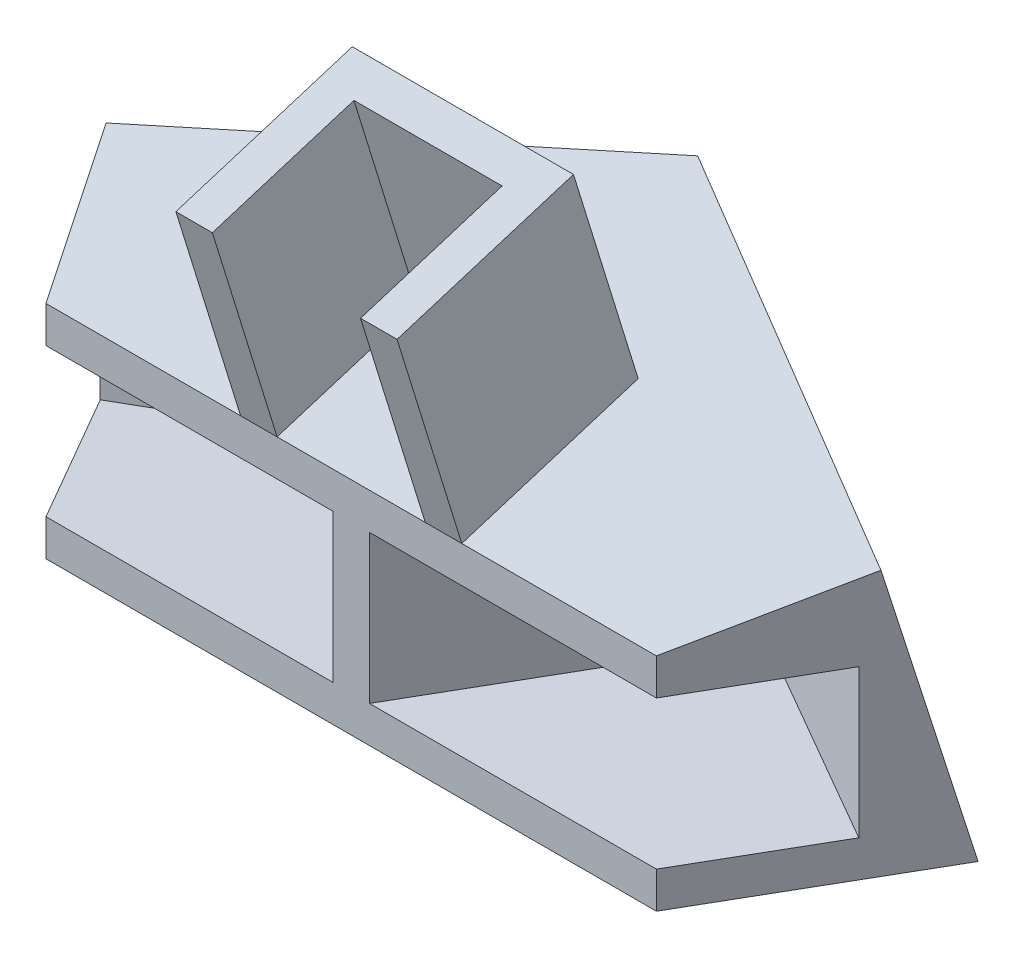
ISO-10303-21;
HEADER;
FILE_DESCRIPTION(('STEP AP214'),'2;1');
FILE_NAME('part.step','',(''),(''),'','','');
FILE_SCHEMA(('AUTOMOTIVE_DESIGN { 1 0 10303 214 1 1 1 1 }'));
ENDSEC;
DATA;
#1=APPLICATION_CONTEXT('core data for automotive mechanical design processes');
#2=APPLICATION_PROTOCOL_DEFINITION('international standard','automotive_design',2000,#1);
#3=PRODUCT_CONTEXT('',#1,'mechanical');
#4=PRODUCT('Part','Part','',(#3));
#5=PRODUCT_RELATED_PRODUCT_CATEGORY('part','',(#4));
#6=PRODUCT_DEFINITION_FORMATION('','',#4);
#7=PRODUCT_DEFINITION_CONTEXT('part definition',#1,'design');
#8=PRODUCT_DEFINITION('design','',#6,#7);
#9=PRODUCT_DEFINITION_SHAPE('','',#8);
#10=(LENGTH_UNIT() NAMED_UNIT(*) SI_UNIT(.MILLI.,.METRE.));
#11=(NAMED_UNIT(*) PLANE_ANGLE_UNIT() SI_UNIT($,.RADIAN.));
#12=(NAMED_UNIT(*) SI_UNIT($,.STERADIAN.) SOLID_ANGLE_UNIT());
#13=UNCERTAINTY_MEASURE_WITH_UNIT(LENGTH_MEASURE(1.E-05),#10,'distance_accuracy_value','');
#14=(GEOMETRIC_REPRESENTATION_CONTEXT(3) GLOBAL_UNCERTAINTY_ASSIGNED_CONTEXT((#13)) GLOBAL_UNIT_ASSIGNED_CONTEXT((#10,
#11,#12)) REPRESENTATION_CONTEXT('',''));
#15=CARTESIAN_POINT('',(0.,0.,0.));
#16=DIRECTION('',(0.,0.,1.));
#17=DIRECTION('',(1.,0.,0.));
#18=AXIS2_PLACEMENT_3D('',#15,#16,#17);
#19=CARTESIAN_POINT('',(-57.939271962345,30.3,24.1398947677254));
#20=DIRECTION('',(0.,-0.955319003127933,-0.295576728215624));
#21=DIRECTION('',(0.,0.295576728215624,-0.955319003127933));
#22=AXIS2_PLACEMENT_3D('',#19,#20,#21);
#23=PLANE('',#22);
#24=DIRECTION('',(-1.,0.,0.));
#25=VECTOR('',#24,1.);
#26=CARTESIAN_POINT('',(0.,37.7780912238553,-0.0296760114113));
#27=LINE('',#26,#25);
#28=CARTESIAN_POINT('',(15.1499999999999,37.7780912238553,-0.0296760114113717));
#29=VERTEX_POINT('',#28);
#30=CARTESIAN_POINT('',(-15.1499999999999,37.7780912238553,-0.0296760114112948));
#31=VERTEX_POINT('',#30);
#32=EDGE_CURVE('E238',#29,#31,#27,.T.);
#33=ORIENTED_EDGE('',*,*,#32,.F.);
#34=DIRECTION('',(0.,-0.295576728215624,0.955319003127932));
#35=VECTOR('',#34,1.);
#36=CARTESIAN_POINT('',(15.1499999999999,37.7780912238553,-0.0296760114113717));
#37=LINE('',#36,#35);
#38=CARTESIAN_POINT('',(15.1500000000001,30.3,24.1398947677253));
#39=VERTEX_POINT('',#38);
#40=EDGE_CURVE('E335',#29,#39,#37,.T.);
#41=ORIENTED_EDGE('',*,*,#40,.T.);
#42=DIRECTION('',(1.,0.,0.));
#43=VECTOR('',#42,1.);
#44=CARTESIAN_POINT('',(-57.939271962345,30.3,24.1398947677254));
#45=LINE('',#44,#43);
#46=CARTESIAN_POINT('',(41.8115242270664,30.3,24.1398947677252));
#47=VERTEX_POINT('',#46);
#48=EDGE_CURVE('E254',#39,#47,#45,.T.);
#49=ORIENTED_EDGE('',*,*,#48,.T.);
#50=DIRECTION('',(-0.482962913144532,-0.258819045102506,0.836516303737813));
#51=VECTOR('',#50,1.);
#52=CARTESIAN_POINT('',(50.4516349060031,34.930221357873,9.17478408878811));
#53=LINE('',#52,#51);
#54=CARTESIAN_POINT('',(53.0714177169951,36.3341587349734,4.6371871553544));
#55=VERTEX_POINT('',#54);
#56=EDGE_CURVE('E55',#55,#47,#53,.T.);
#57=ORIENTED_EDGE('',*,*,#56,.F.);
#58=DIRECTION('',(0.875640807938362,-0.142752597716748,0.461383648732997));
#59=VECTOR('',#58,1.);
#60=CARTESIAN_POINT('',(-50.6819620165036,53.2487021694221,-50.0314766116174));
#61=LINE('',#60,#59);
#62=CARTESIAN_POINT('',(0.,44.9862026723147,-23.3266584394525));
#63=VERTEX_POINT('',#62);
#64=EDGE_CURVE('E11',#63,#55,#61,.T.);
#65=ORIENTED_EDGE('',*,*,#64,.F.);
#66=DIRECTION('',(0.875640807938359,0.142752597716748,-0.461383648733001));
#67=VECTOR('',#66,1.);
#68=CARTESIAN_POINT('',(7.22750804474477,46.164477530056,-27.1349026449534));
#69=LINE('',#68,#67);
#70=CARTESIAN_POINT('',(-53.0714177169951,36.3341587349734,4.63718715535465));
#71=VERTEX_POINT('',#70);
#72=EDGE_CURVE('E40',#71,#63,#69,.T.);
#73=ORIENTED_EDGE('',*,*,#72,.F.);
#74=DIRECTION('',(-0.482962913144536,0.258819045102507,-0.836516303737811));
#75=VECTOR('',#74,1.);
#76=CARTESIAN_POINT('',(-50.4516349060031,34.930221357873,9.17478408878837));
#77=LINE('',#76,#75);
#78=CARTESIAN_POINT('',(-41.8115242270663,30.3,24.1398947677254));
#79=VERTEX_POINT('',#78);
#80=EDGE_CURVE('E258',#79,#71,#77,.T.);
#81=ORIENTED_EDGE('',*,*,#80,.F.);
#82=CARTESIAN_POINT('',(-15.15,30.3,24.1398947677253));
#83=VERTEX_POINT('',#82);
#84=EDGE_CURVE('E255',#79,#83,#45,.T.);
#85=ORIENTED_EDGE('',*,*,#84,.T.);
#86=DIRECTION('',(0.,-0.295576728215624,0.955319003127932));
#87=VECTOR('',#86,1.);
#88=CARTESIAN_POINT('',(-15.1499999999999,37.7780912238553,-0.0296760114112948));
#89=LINE('',#88,#87);
#90=EDGE_CURVE('E222',#31,#83,#89,.T.);
#91=ORIENTED_EDGE('',*,*,#90,.F.);
#92=EDGE_LOOP('',(#33,#41,#49,#57,#65,#73,#81,#85,#91));
#93=FACE_BOUND('',#92,.T.);
#94=ADVANCED_FACE('F32',(#93),#23,.F.);
#95=CARTESIAN_POINT('',(54.4615242270663,5.,2.22945205197881));
#96=DIRECTION('',(0.866025403784441,0.,0.499999999999996));
#97=DIRECTION('',(0.499999999999996,0.,-0.866025403784441));
#98=AXIS2_PLACEMENT_3D('',#95,#96,#97);
#99=PLANE('',#98);
#100=DIRECTION('',(-0.129409522551252,0.965925826289072,0.224143868042001));
#101=VECTOR('',#100,1.);
#102=CARTESIAN_POINT('',(57.9392719623449,0.,-3.79418372143149));
#103=LINE('',#102,#101);
#104=CARTESIAN_POINT('',(57.9392719623449,0.,-3.79418372143149));
#105=VERTEX_POINT('',#104);
#106=EDGE_CURVE('E375',#105,#55,#103,.T.);
#107=ORIENTED_EDGE('',*,*,#106,.T.);
#108=ORIENTED_EDGE('',*,*,#56,.T.);
#109=DIRECTION('',(0.,-1.,0.));
#110=VECTOR('',#109,1.);
#111=CARTESIAN_POINT('',(41.8115242270664,30.3,24.1398947677251));
#112=LINE('',#111,#110);
#113=CARTESIAN_POINT('',(41.8115242270664,25.3,24.1398947677251));
#114=VERTEX_POINT('',#113);
#115=EDGE_CURVE('E343',#47,#114,#112,.T.);
#116=ORIENTED_EDGE('',*,*,#115,.T.);
#117=DIRECTION('',(-0.499999999999997,0.,0.86602540378444));
#118=VECTOR('',#117,1.);
#119=CARTESIAN_POINT('',(65.1667800070895,25.3,-16.3125948670419));
#120=LINE('',#119,#118);
#121=CARTESIAN_POINT('',(51.9615242270663,25.3,6.55957907090102));
#122=VERTEX_POINT('',#121);
#123=EDGE_CURVE('E383',#122,#114,#120,.T.);
#124=ORIENTED_EDGE('',*,*,#123,.F.);
#125=DIRECTION('',(0.,-1.,0.));
#126=VECTOR('',#125,1.);
#127=CARTESIAN_POINT('',(51.9615242270663,25.3,6.55957907090102));
#128=LINE('',#127,#126);
#129=CARTESIAN_POINT('',(51.9615242270663,5.,6.55957907090102));
#130=VERTEX_POINT('',#129);
#131=EDGE_CURVE('E206',#122,#130,#128,.T.);
#132=ORIENTED_EDGE('',*,*,#131,.T.);
#133=DIRECTION('',(-0.499999999999999,0.,0.866025403784439));
#134=VECTOR('',#133,1.);
#135=CARTESIAN_POINT('',(54.4615242270663,5.,2.22945205197881));
#136=LINE('',#135,#134);
#137=CARTESIAN_POINT('',(41.8115242270664,5.,24.1398947677251));
#138=VERTEX_POINT('',#137);
#139=EDGE_CURVE('E198',#130,#138,#136,.T.);
#140=ORIENTED_EDGE('',*,*,#139,.T.);
#141=DIRECTION('',(0.,-1.,0.));
#142=VECTOR('',#141,1.);
#143=CARTESIAN_POINT('',(41.8115242270664,5.,24.1398947677251));
#144=LINE('',#143,#142);
#145=CARTESIAN_POINT('',(41.8115242270664,0.,24.1398947677251));
#146=VERTEX_POINT('',#145);
#147=EDGE_CURVE('E197',#138,#146,#144,.T.);
#148=ORIENTED_EDGE('',*,*,#147,.T.);
#149=DIRECTION('',(-0.499999999999996,0.,0.866025403784441));
#150=VECTOR('',#149,1.);
#151=CARTESIAN_POINT('',(54.4615242270663,0.,2.22945205197881));
#152=LINE('',#151,#150);
#153=EDGE_CURVE('E202',#105,#146,#152,.T.);
#154=ORIENTED_EDGE('',*,*,#153,.F.);
#155=EDGE_LOOP('',(#107,#108,#116,#124,#132,#140,#148,#154));
#156=FACE_BOUND('',#155,.T.);
#157=ADVANCED_FACE('F392',(#156),#99,.T.);
#158=CARTESIAN_POINT('',(-41.8115242270663,5.,24.1398947677253));
#159=DIRECTION('',(0.,0.,-1.));
#160=DIRECTION('',(-1.,0.,0.));
#161=AXIS2_PLACEMENT_3D('',#158,#159,#160);
#162=PLANE('',#161);
#163=ORIENTED_EDGE('',*,*,#115,.F.);
#164=ORIENTED_EDGE('',*,*,#48,.F.);
#165=DIRECTION('',(-1.,0.,0.));
#166=VECTOR('',#165,1.);
#167=CARTESIAN_POINT('',(10.1500000000001,30.3,24.1398947677253));
#168=LINE('',#167,#166);
#169=CARTESIAN_POINT('',(10.1500000000001,30.3,24.1398947677253));
#170=VERTEX_POINT('',#169);
#171=EDGE_CURVE('E181',#39,#170,#168,.T.);
#172=ORIENTED_EDGE('',*,*,#171,.T.);
#173=CARTESIAN_POINT('',(-10.15,30.3,24.1398947677253));
#174=VERTEX_POINT('',#173);
#175=EDGE_CURVE('E259',#174,#170,#45,.T.);
#176=ORIENTED_EDGE('',*,*,#175,.F.);
#177=DIRECTION('',(1.,0.,0.));
#178=VECTOR('',#177,1.);
#179=CARTESIAN_POINT('',(-10.1499999999999,30.3,24.1398947677254));
#180=LINE('',#179,#178);
#181=EDGE_CURVE('E215',#83,#174,#180,.T.);
#182=ORIENTED_EDGE('',*,*,#181,.F.);
#183=ORIENTED_EDGE('',*,*,#84,.F.);
#184=DIRECTION('',(0.,-1.,0.));
#185=VECTOR('',#184,1.);
#186=CARTESIAN_POINT('',(-41.8115242270663,30.3,24.1398947677253));
#187=LINE('',#186,#185);
#188=CARTESIAN_POINT('',(-41.8115242270663,25.3,24.1398947677253));
#189=VERTEX_POINT('',#188);
#190=EDGE_CURVE('E276',#79,#189,#187,.T.);
#191=ORIENTED_EDGE('',*,*,#190,.T.);
#192=DIRECTION('',(1.,0.,0.));
#193=VECTOR('',#192,1.);
#194=CARTESIAN_POINT('',(-41.8115242270663,25.3,24.1398947677253));
#195=LINE('',#194,#193);
#196=CARTESIAN_POINT('',(-2.5,25.3,24.1398947677253));
#197=VERTEX_POINT('',#196);
#198=EDGE_CURVE('E273',#189,#197,#195,.T.);
#199=ORIENTED_EDGE('',*,*,#198,.T.);
#200=DIRECTION('',(0.,-1.,0.));
#201=VECTOR('',#200,1.);
#202=CARTESIAN_POINT('',(-2.5,77.9226337103302,24.1398947677253));
#203=LINE('',#202,#201);
#204=CARTESIAN_POINT('',(-2.5,5.,24.1398947677253));
#205=VERTEX_POINT('',#204);
#206=EDGE_CURVE('E211',#197,#205,#203,.T.);
#207=ORIENTED_EDGE('',*,*,#206,.T.);
#208=DIRECTION('',(1.,0.,0.));
#209=VECTOR('',#208,1.);
#210=CARTESIAN_POINT('',(-41.8115242270663,5.,24.1398947677253));
#211=LINE('',#210,#209);
#212=CARTESIAN_POINT('',(-41.8115242270663,5.,24.1398947677253));
#213=VERTEX_POINT('',#212);
#214=EDGE_CURVE('E290',#213,#205,#211,.T.);
#215=ORIENTED_EDGE('',*,*,#214,.F.);
#216=DIRECTION('',(0.,-1.,0.));
#217=VECTOR('',#216,1.);
#218=CARTESIAN_POINT('',(-41.8115242270663,5.,24.1398947677253));
#219=LINE('',#218,#217);
#220=CARTESIAN_POINT('',(-41.8115242270663,0.,24.1398947677253));
#221=VERTEX_POINT('',#220);
#222=EDGE_CURVE('E294',#213,#221,#219,.T.);
#223=ORIENTED_EDGE('',*,*,#222,.T.);
#224=DIRECTION('',(1.,0.,0.));
#225=VECTOR('',#224,1.);
#226=CARTESIAN_POINT('',(-41.8115242270663,0.,24.1398947677253));
#227=LINE('',#226,#225);
#228=EDGE_CURVE('E291',#221,#146,#227,.T.);
#229=ORIENTED_EDGE('',*,*,#228,.T.);
#230=ORIENTED_EDGE('',*,*,#147,.F.);
#231=DIRECTION('',(-1.,0.,0.));
#232=VECTOR('',#231,1.);
#233=CARTESIAN_POINT('',(41.8115242270664,5.,24.1398947677251));
#234=LINE('',#233,#232);
#235=CARTESIAN_POINT('',(2.50000000000012,5.,24.1398947677253));
#236=VERTEX_POINT('',#235);
#237=EDGE_CURVE('E188',#138,#236,#234,.T.);
#238=ORIENTED_EDGE('',*,*,#237,.T.);
#239=DIRECTION('',(0.,-1.,0.));
#240=VECTOR('',#239,1.);
#241=CARTESIAN_POINT('',(2.50000000000012,77.9226337103303,24.1398947677253));
#242=LINE('',#241,#240);
#243=CARTESIAN_POINT('',(2.50000000000012,25.3,24.1398947677253));
#244=VERTEX_POINT('',#243);
#245=EDGE_CURVE('E172',#244,#236,#242,.T.);
#246=ORIENTED_EDGE('',*,*,#245,.F.);
#247=DIRECTION('',(-1.,0.,0.));
#248=VECTOR('',#247,1.);
#249=CARTESIAN_POINT('',(41.8115242270664,25.3,24.1398947677251));
#250=LINE('',#249,#248);
#251=EDGE_CURVE('E381',#114,#244,#250,.T.);
#252=ORIENTED_EDGE('',*,*,#251,.F.);
#253=EDGE_LOOP('',(#163,#164,#172,#176,#182,#183,#191,#199,#207,#215,#223,#229,#230,#238,#246,#252));
#254=FACE_BOUND('',#253,.T.);
#255=ADVANCED_FACE('F194',(#254),#162,.F.);
#256=CARTESIAN_POINT('',(-50.6819620165036,0.,-66.5066823988284));
#257=DIRECTION('',(0.482962913144532,0.258819045102506,-0.836516303737813));
#258=DIRECTION('',(-0.866025403784441,0.,-0.499999999999996));
#259=AXIS2_PLACEMENT_3D('',#256,#257,#258);
#260=PLANE('',#259);
#261=DIRECTION('',(0.,0.955319003127933,0.295576728215624));
#262=VECTOR('',#261,1.);
#263=CARTESIAN_POINT('',(0.,-0.14992744227824,-37.2918256976186));
#264=LINE('',#263,#262);
#265=CARTESIAN_POINT('',(-2.62397636848534E-13,0.,-37.2454379855421));
#266=VERTEX_POINT('',#265);
#267=EDGE_CURVE('E267',#266,#63,#264,.T.);
#268=ORIENTED_EDGE('',*,*,#267,.T.);
#269=ORIENTED_EDGE('',*,*,#64,.T.);
#270=ORIENTED_EDGE('',*,*,#106,.F.);
#271=DIRECTION('',(0.866025403784441,0.,0.499999999999996));
#272=VECTOR('',#271,1.);
#273=CARTESIAN_POINT('',(-50.6819620165036,0.,-66.5066823988284));
#274=LINE('',#273,#272);
#275=EDGE_CURVE('E378',#266,#105,#274,.T.);
#276=ORIENTED_EDGE('',*,*,#275,.F.);
#277=EDGE_LOOP('',(#268,#269,#270,#276));
#278=FACE_BOUND('',#277,.T.);
#279=ADVANCED_FACE('F440',(#278),#260,.T.);
#280=CARTESIAN_POINT('',(0.,0.,0.));
#281=DIRECTION('',(0.,-1.,0.));
#282=DIRECTION('',(0.,0.,-1.));
#283=AXIS2_PLACEMENT_3D('',#280,#281,#282);
#284=PLANE('',#283);
#285=DIRECTION('',(-0.866025403784438,0.,0.5));
#286=VECTOR('',#285,1.);
#287=CARTESIAN_POINT('',(7.22750804474474,0.,-41.4182417007456));
#288=LINE('',#287,#286);
#289=CARTESIAN_POINT('',(-57.939271962345,0.,-3.79418372143119));
#290=VERTEX_POINT('',#289);
#291=EDGE_CURVE('E265',#266,#290,#288,.T.);
#292=ORIENTED_EDGE('',*,*,#291,.F.);
#293=ORIENTED_EDGE('',*,*,#275,.T.);
#294=ORIENTED_EDGE('',*,*,#153,.T.);
#295=ORIENTED_EDGE('',*,*,#228,.F.);
#296=DIRECTION('',(0.5,0.,0.866025403784438));
#297=VECTOR('',#296,1.);
#298=CARTESIAN_POINT('',(-54.4615242270663,0.,2.22945205197908));
#299=LINE('',#298,#297);
#300=EDGE_CURVE('E287',#290,#221,#299,.T.);
#301=ORIENTED_EDGE('',*,*,#300,.F.);
#302=EDGE_LOOP('',(#292,#293,#294,#295,#301));
#303=FACE_BOUND('',#302,.T.);
#304=ADVANCED_FACE('F437',(#303),#284,.T.);
#305=CARTESIAN_POINT('',(0.,5.,0.));
#306=DIRECTION('',(0.,-1.,0.));
#307=DIRECTION('',(0.,0.,-1.));
#308=AXIS2_PLACEMENT_3D('',#305,#306,#307);
#309=PLANE('',#308);
#310=DIRECTION('',(0.5,0.,0.866025403784438));
#311=VECTOR('',#310,1.);
#312=CARTESIAN_POINT('',(-2.5,5.,24.1398947677253));
#313=LINE('',#312,#311);
#314=CARTESIAN_POINT('',(-22.4778810567665,5.,-10.4628102501621));
#315=VERTEX_POINT('',#314);
#316=EDGE_CURVE('E208',#315,#205,#313,.T.);
#317=ORIENTED_EDGE('',*,*,#316,.F.);
#318=DIRECTION('',(0.866025403784439,0.,-0.5));
#319=VECTOR('',#318,1.);
#320=CARTESIAN_POINT('',(-51.9615242270662,5.,6.55957907090129));
#321=LINE('',#320,#319);
#322=CARTESIAN_POINT('',(-51.9615242270662,5.,6.55957907090129));
#323=VERTEX_POINT('',#322);
#324=EDGE_CURVE('E278',#323,#315,#321,.T.);
#325=ORIENTED_EDGE('',*,*,#324,.F.);
#326=DIRECTION('',(0.500000000000003,0.,0.866025403784437));
#327=VECTOR('',#326,1.);
#328=CARTESIAN_POINT('',(-54.4615242270663,5.,2.22945205197908));
#329=LINE('',#328,#327);
#330=EDGE_CURVE('E288',#323,#213,#329,.T.);
#331=ORIENTED_EDGE('',*,*,#330,.T.);
#332=ORIENTED_EDGE('',*,*,#214,.T.);
#333=EDGE_LOOP('',(#317,#325,#331,#332));
#334=FACE_BOUND('',#333,.T.);
#335=ADVANCED_FACE('F431',(#334),#309,.F.);
#336=CARTESIAN_POINT('',(-51.9615242270662,25.3,6.55957907090129));
#337=DIRECTION('',(-0.5,0.,-0.866025403784439));
#338=DIRECTION('',(-0.866025403784439,0.,0.5));
#339=AXIS2_PLACEMENT_3D('',#336,#337,#338);
#340=PLANE('',#339);
#341=DIRECTION('',(0.,-1.,0.));
#342=VECTOR('',#341,1.);
#343=CARTESIAN_POINT('',(-22.4778810567665,77.9226337103302,-10.4628102501621));
#344=LINE('',#343,#342);
#345=CARTESIAN_POINT('',(-22.4778810567665,25.3,-10.4628102501621));
#346=VERTEX_POINT('',#345);
#347=EDGE_CURVE('E200',#346,#315,#344,.T.);
#348=ORIENTED_EDGE('',*,*,#347,.F.);
#349=DIRECTION('',(0.866025403784439,0.,-0.5));
#350=VECTOR('',#349,1.);
#351=CARTESIAN_POINT('',(-51.9615242270662,25.3,6.55957907090129));
#352=LINE('',#351,#350);
#353=CARTESIAN_POINT('',(-51.9615242270662,25.3,6.55957907090129));
#354=VERTEX_POINT('',#353);
#355=EDGE_CURVE('E279',#354,#346,#352,.T.);
#356=ORIENTED_EDGE('',*,*,#355,.F.);
#357=DIRECTION('',(0.,-1.,0.));
#358=VECTOR('',#357,1.);
#359=CARTESIAN_POINT('',(-51.9615242270662,25.3,6.55957907090129));
#360=LINE('',#359,#358);
#361=EDGE_CURVE('E282',#354,#323,#360,.T.);
#362=ORIENTED_EDGE('',*,*,#361,.T.);
#363=ORIENTED_EDGE('',*,*,#324,.T.);
#364=EDGE_LOOP('',(#348,#356,#362,#363));
#365=FACE_BOUND('',#364,.T.);
#366=ADVANCED_FACE('F425',(#365),#340,.F.);
#367=CARTESIAN_POINT('',(0.,25.3,0.));
#368=DIRECTION('',(0.,1.,0.));
#369=DIRECTION('',(0.,0.,1.));
#370=AXIS2_PLACEMENT_3D('',#367,#368,#369);
#371=PLANE('',#370);
#372=DIRECTION('',(0.5,0.,0.866025403784439));
#373=VECTOR('',#372,1.);
#374=CARTESIAN_POINT('',(-2.5,25.3,24.1398947677253));
#375=LINE('',#374,#373);
#376=EDGE_CURVE('E212',#346,#197,#375,.T.);
#377=ORIENTED_EDGE('',*,*,#376,.T.);
#378=ORIENTED_EDGE('',*,*,#198,.F.);
#379=DIRECTION('',(0.500000000000002,0.,0.866025403784438));
#380=VECTOR('',#379,1.);
#381=CARTESIAN_POINT('',(-65.1667800070896,25.3,-16.3125948670415));
#382=LINE('',#381,#380);
#383=EDGE_CURVE('E270',#354,#189,#382,.T.);
#384=ORIENTED_EDGE('',*,*,#383,.F.);
#385=ORIENTED_EDGE('',*,*,#355,.T.);
#386=EDGE_LOOP('',(#377,#378,#384,#385));
#387=FACE_BOUND('',#386,.T.);
#388=ADVANCED_FACE('F420',(#387),#371,.F.);
#389=DIRECTION('',(0.,0.295576728215625,-0.955319003127933));
#390=VECTOR('',#389,1.);
#391=CARTESIAN_POINT('',(10.1500000000001,30.3,24.1398947677253));
#392=LINE('',#391,#390);
#393=CARTESIAN_POINT('',(10.15,36.3002075827772,4.74691900422832));
#394=VERTEX_POINT('',#393);
#395=EDGE_CURVE('E338',#170,#394,#392,.T.);
#396=ORIENTED_EDGE('',*,*,#395,.T.);
#397=DIRECTION('',(1.,0.,0.));
#398=VECTOR('',#397,1.);
#399=CARTESIAN_POINT('',(-10.1499999999999,36.3002075827772,4.74691900422837));
#400=LINE('',#399,#398);
#401=CARTESIAN_POINT('',(-10.1499999999999,36.3002075827772,4.74691900422837));
#402=VERTEX_POINT('',#401);
#403=EDGE_CURVE('E236',#402,#394,#400,.T.);
#404=ORIENTED_EDGE('',*,*,#403,.F.);
#405=DIRECTION('',(0.,0.295576728215625,-0.955319003127933));
#406=VECTOR('',#405,1.);
#407=CARTESIAN_POINT('',(-10.1499999999999,30.3,24.1398947677254));
#408=LINE('',#407,#406);
#409=EDGE_CURVE('E233',#174,#402,#408,.T.);
#410=ORIENTED_EDGE('',*,*,#409,.F.);
#411=ORIENTED_EDGE('',*,*,#175,.T.);
#412=EDGE_LOOP('',(#396,#404,#410,#411));
#413=FACE_BOUND('',#412,.T.);
#414=ADVANCED_FACE('F346',(#413),#23,.F.);
#415=CARTESIAN_POINT('',(-54.4615242270663,5.,2.22945205197908));
#416=DIRECTION('',(0.866025403784438,0.,-0.5));
#417=DIRECTION('',(-0.5,0.,-0.866025403784438));
#418=AXIS2_PLACEMENT_3D('',#415,#416,#417);
#419=PLANE('',#418);
#420=ORIENTED_EDGE('',*,*,#190,.F.);
#421=ORIENTED_EDGE('',*,*,#80,.T.);
#422=DIRECTION('',(0.129409522551253,0.965925826289072,0.224143868042001));
#423=VECTOR('',#422,1.);
#424=CARTESIAN_POINT('',(-57.939271962345,0.,-3.79418372143119));
#425=LINE('',#424,#423);
#426=EDGE_CURVE('E262',#290,#71,#425,.T.);
#427=ORIENTED_EDGE('',*,*,#426,.F.);
#428=ORIENTED_EDGE('',*,*,#300,.T.);
#429=ORIENTED_EDGE('',*,*,#222,.F.);
#430=ORIENTED_EDGE('',*,*,#330,.F.);
#431=ORIENTED_EDGE('',*,*,#361,.F.);
#432=ORIENTED_EDGE('',*,*,#383,.T.);
#433=EDGE_LOOP('',(#420,#421,#427,#428,#429,#430,#431,#432));
#434=FACE_BOUND('',#433,.T.);
#435=ADVANCED_FACE('F34',(#434),#419,.F.);
#436=CARTESIAN_POINT('',(7.22750804474474,0.,-41.4182417007456));
#437=DIRECTION('',(0.482962913144537,-0.258819045102506,0.836516303737811));
#438=DIRECTION('',(0.866025403784438,0.,-0.500000000000001));
#439=AXIS2_PLACEMENT_3D('',#436,#437,#438);
#440=PLANE('',#439);
#441=ORIENTED_EDGE('',*,*,#426,.T.);
#442=ORIENTED_EDGE('',*,*,#72,.T.);
#443=ORIENTED_EDGE('',*,*,#267,.F.);
#444=ORIENTED_EDGE('',*,*,#291,.T.);
#445=EDGE_LOOP('',(#441,#442,#443,#444));
#446=FACE_BOUND('',#445,.T.);
#447=ADVANCED_FACE('F301',(#446),#440,.F.);
#448=CARTESIAN_POINT('',(-10.1499999999999,58.959570093838,33.0071966141941));
#449=DIRECTION('',(0.,0.295576728215624,-0.955319003127933));
#450=DIRECTION('',(0.,0.955319003127933,0.295576728215624));
#451=AXIS2_PLACEMENT_3D('',#448,#449,#450);
#452=PLANE('',#451);
#453=ORIENTED_EDGE('',*,*,#181,.T.);
#454=DIRECTION('',(0.,-0.955319003127933,-0.295576728215624));
#455=VECTOR('',#454,1.);
#456=CARTESIAN_POINT('',(-10.1499999999999,58.959570093838,33.0071966141941));
#457=LINE('',#456,#455);
#458=CARTESIAN_POINT('',(-10.1499999999999,58.959570093838,33.0071966141941));
#459=VERTEX_POINT('',#458);
#460=EDGE_CURVE('E251',#459,#174,#457,.T.);
#461=ORIENTED_EDGE('',*,*,#460,.F.);
#462=DIRECTION('',(1.,0.,0.));
#463=VECTOR('',#462,1.);
#464=CARTESIAN_POINT('',(-10.1499999999999,58.959570093838,33.0071966141941));
#465=LINE('',#464,#463);
#466=CARTESIAN_POINT('',(-15.1499999999999,58.959570093838,33.0071966141941));
#467=VERTEX_POINT('',#466);
#468=EDGE_CURVE('E218',#467,#459,#465,.T.);
#469=ORIENTED_EDGE('',*,*,#468,.F.);
#470=DIRECTION('',(0.,-0.955319003127933,-0.295576728215624));
#471=VECTOR('',#470,1.);
#472=CARTESIAN_POINT('',(-15.1499999999999,58.959570093838,33.0071966141941));
#473=LINE('',#472,#471);
#474=EDGE_CURVE('E230',#467,#83,#473,.T.);
#475=ORIENTED_EDGE('',*,*,#474,.T.);
#476=EDGE_LOOP('',(#453,#461,#469,#475));
#477=FACE_BOUND('',#476,.T.);
#478=ADVANCED_FACE('F319',(#477),#452,.F.);
#479=CARTESIAN_POINT('',(-10.1499999999999,58.959570093838,33.0071966141941));
#480=DIRECTION('',(-1.,0.,0.));
#481=DIRECTION('',(0.,-1.,0.));
#482=AXIS2_PLACEMENT_3D('',#479,#480,#481);
#483=PLANE('',#482);
#484=ORIENTED_EDGE('',*,*,#409,.T.);
#485=DIRECTION('',(0.,-0.955319003127933,-0.295576728215624));
#486=VECTOR('',#485,1.);
#487=CARTESIAN_POINT('',(-10.1499999999999,64.9597776766151,13.6142208506971));
#488=LINE('',#487,#486);
#489=CARTESIAN_POINT('',(-10.1499999999999,64.9597776766151,13.6142208506971));
#490=VERTEX_POINT('',#489);
#491=EDGE_CURVE('E248',#490,#402,#488,.T.);
#492=ORIENTED_EDGE('',*,*,#491,.F.);
#493=DIRECTION('',(0.,0.295576728215625,-0.955319003127933));
#494=VECTOR('',#493,1.);
#495=CARTESIAN_POINT('',(-10.1499999999999,58.959570093838,33.0071966141941));
#496=LINE('',#495,#494);
#497=EDGE_CURVE('E221',#459,#490,#496,.T.);
#498=ORIENTED_EDGE('',*,*,#497,.F.);
#499=ORIENTED_EDGE('',*,*,#460,.T.);
#500=EDGE_LOOP('',(#484,#492,#498,#499));
#501=FACE_BOUND('',#500,.T.);
#502=ADVANCED_FACE('F349',(#501),#483,.F.);
#503=CARTESIAN_POINT('',(-10.1499999999999,64.9597776766151,13.6142208506971));
#504=DIRECTION('',(0.,0.295576728215624,-0.955319003127933));
#505=DIRECTION('',(0.,0.955319003127933,0.295576728215624));
#506=AXIS2_PLACEMENT_3D('',#503,#504,#505);
#507=PLANE('',#506);
#508=ORIENTED_EDGE('',*,*,#403,.T.);
#509=DIRECTION('',(0.,-0.955319003127933,-0.295576728215624));
#510=VECTOR('',#509,1.);
#511=CARTESIAN_POINT('',(10.15,64.9597776766151,13.614220850697));
#512=LINE('',#511,#510);
#513=CARTESIAN_POINT('',(10.15,64.9597776766151,13.614220850697));
#514=VERTEX_POINT('',#513);
#515=EDGE_CURVE('E355',#514,#394,#512,.T.);
#516=ORIENTED_EDGE('',*,*,#515,.F.);
#517=DIRECTION('',(1.,0.,0.));
#518=VECTOR('',#517,1.);
#519=CARTESIAN_POINT('',(-10.1499999999999,64.9597776766151,13.6142208506971));
#520=LINE('',#519,#518);
#521=EDGE_CURVE('E224',#490,#514,#520,.T.);
#522=ORIENTED_EDGE('',*,*,#521,.F.);
#523=ORIENTED_EDGE('',*,*,#491,.T.);
#524=EDGE_LOOP('',(#508,#516,#522,#523));
#525=FACE_BOUND('',#524,.T.);
#526=ADVANCED_FACE('F353',(#525),#507,.F.);
#527=CARTESIAN_POINT('',(0.,66.4376613176933,8.83762583505743));
#528=DIRECTION('',(0.,-0.295576728215624,0.955319003127932));
#529=DIRECTION('',(0.,-0.955319003127933,-0.295576728215624));
#530=AXIS2_PLACEMENT_3D('',#527,#528,#529);
#531=PLANE('',#530);
#532=ORIENTED_EDGE('',*,*,#32,.T.);
#533=DIRECTION('',(0.,-0.955319003127933,-0.295576728215624));
#534=VECTOR('',#533,1.);
#535=CARTESIAN_POINT('',(-15.1499999999999,66.4376613176933,8.83762583505744));
#536=LINE('',#535,#534);
#537=CARTESIAN_POINT('',(-15.1499999999999,66.4376613176933,8.83762583505744));
#538=VERTEX_POINT('',#537);
#539=EDGE_CURVE('E245',#538,#31,#536,.T.);
#540=ORIENTED_EDGE('',*,*,#539,.F.);
#541=DIRECTION('',(-1.,0.,0.));
#542=VECTOR('',#541,1.);
#543=CARTESIAN_POINT('',(0.,66.4376613176933,8.83762583505743));
#544=LINE('',#543,#542);
#545=CARTESIAN_POINT('',(15.15,66.4376613176933,8.83762583505736));
#546=VERTEX_POINT('',#545);
#547=EDGE_CURVE('E226',#546,#538,#544,.T.);
#548=ORIENTED_EDGE('',*,*,#547,.F.);
#549=DIRECTION('',(0.,-0.955319003127933,-0.295576728215624));
#550=VECTOR('',#549,1.);
#551=CARTESIAN_POINT('',(15.15,66.4376613176933,8.83762583505736));
#552=LINE('',#551,#550);
#553=EDGE_CURVE('E332',#546,#29,#552,.T.);
#554=ORIENTED_EDGE('',*,*,#553,.T.);
#555=EDGE_LOOP('',(#532,#540,#548,#554));
#556=FACE_BOUND('',#555,.T.);
#557=ADVANCED_FACE('F331',(#556),#531,.F.);
#558=CARTESIAN_POINT('',(-15.1499999999999,66.4376613176933,8.83762583505744));
#559=DIRECTION('',(1.,0.,0.));
#560=DIRECTION('',(0.,1.,0.));
#561=AXIS2_PLACEMENT_3D('',#558,#559,#560);
#562=PLANE('',#561);
#563=ORIENTED_EDGE('',*,*,#90,.T.);
#564=ORIENTED_EDGE('',*,*,#474,.F.);
#565=DIRECTION('',(0.,-0.295576728215624,0.955319003127932));
#566=VECTOR('',#565,1.);
#567=CARTESIAN_POINT('',(-15.1499999999999,66.4376613176933,8.83762583505744));
#568=LINE('',#567,#566);
#569=EDGE_CURVE('E228',#538,#467,#568,.T.);
#570=ORIENTED_EDGE('',*,*,#569,.F.);
#571=ORIENTED_EDGE('',*,*,#539,.T.);
#572=EDGE_LOOP('',(#563,#564,#570,#571));
#573=FACE_BOUND('',#572,.T.);
#574=ADVANCED_FACE('F314',(#573),#562,.F.);
#575=CARTESIAN_POINT('',(0.,63.1287760083062,19.5321112714151));
#576=DIRECTION('',(0.,0.955319003127933,0.295576728215624));
#577=DIRECTION('',(0.,-0.295576728215624,0.955319003127933));
#578=AXIS2_PLACEMENT_3D('',#575,#576,#577);
#579=PLANE('',#578);
#580=ORIENTED_EDGE('',*,*,#468,.T.);
#581=ORIENTED_EDGE('',*,*,#497,.T.);
#582=ORIENTED_EDGE('',*,*,#521,.T.);
#583=DIRECTION('',(0.,0.295576728215625,-0.955319003127933));
#584=VECTOR('',#583,1.);
#585=CARTESIAN_POINT('',(10.1500000000001,58.959570093838,33.0071966141941));
#586=LINE('',#585,#584);
#587=CARTESIAN_POINT('',(10.1500000000001,58.959570093838,33.0071966141941));
#588=VERTEX_POINT('',#587);
#589=EDGE_CURVE('E358',#588,#514,#586,.T.);
#590=ORIENTED_EDGE('',*,*,#589,.F.);
#591=DIRECTION('',(-1.,0.,0.));
#592=VECTOR('',#591,1.);
#593=CARTESIAN_POINT('',(10.1500000000001,58.959570093838,33.0071966141941));
#594=LINE('',#593,#592);
#595=CARTESIAN_POINT('',(15.1500000000001,58.959570093838,33.0071966141941));
#596=VERTEX_POINT('',#595);
#597=EDGE_CURVE('E360',#596,#588,#594,.T.);
#598=ORIENTED_EDGE('',*,*,#597,.F.);
#599=DIRECTION('',(0.,-0.295576728215624,0.955319003127932));
#600=VECTOR('',#599,1.);
#601=CARTESIAN_POINT('',(15.15,66.4376613176933,8.83762583505736));
#602=LINE('',#601,#600);
#603=EDGE_CURVE('E327',#546,#596,#602,.T.);
#604=ORIENTED_EDGE('',*,*,#603,.F.);
#605=ORIENTED_EDGE('',*,*,#547,.T.);
#606=ORIENTED_EDGE('',*,*,#569,.T.);
#607=EDGE_LOOP('',(#580,#581,#582,#590,#598,#604,#605,#606));
#608=FACE_BOUND('',#607,.T.);
#609=ADVANCED_FACE('F322',(#608),#579,.T.);
#610=CARTESIAN_POINT('',(-2.5,77.9226337103302,24.1398947677253));
#611=DIRECTION('',(0.866025403784438,0.,-0.5));
#612=DIRECTION('',(-0.5,0.,-0.866025403784439));
#613=AXIS2_PLACEMENT_3D('',#610,#611,#612);
#614=PLANE('',#613);
#615=ORIENTED_EDGE('',*,*,#376,.F.);
#616=ORIENTED_EDGE('',*,*,#347,.T.);
#617=ORIENTED_EDGE('',*,*,#316,.T.);
#618=ORIENTED_EDGE('',*,*,#206,.F.);
#619=EDGE_LOOP('',(#615,#616,#617,#618));
#620=FACE_BOUND('',#619,.T.);
#621=ADVANCED_FACE('F457',(#620),#614,.F.);
#622=CARTESIAN_POINT('',(0.,5.,0.));
#623=DIRECTION('',(0.,-1.,0.));
#624=DIRECTION('',(0.,0.,-1.));
#625=AXIS2_PLACEMENT_3D('',#622,#623,#624);
#626=PLANE('',#625);
#627=DIRECTION('',(-0.866025403784441,0.,-0.499999999999996));
#628=VECTOR('',#627,1.);
#629=CARTESIAN_POINT('',(51.9615242270663,5.,6.55957907090102));
#630=LINE('',#629,#628);
#631=CARTESIAN_POINT('',(22.4778810567665,5.,-10.4628102501622));
#632=VERTEX_POINT('',#631);
#633=EDGE_CURVE('E190',#130,#632,#630,.T.);
#634=ORIENTED_EDGE('',*,*,#633,.T.);
#635=DIRECTION('',(-0.499999999999996,0.,0.866025403784441));
#636=VECTOR('',#635,1.);
#637=CARTESIAN_POINT('',(2.50000000000012,5.,24.1398947677253));
#638=LINE('',#637,#636);
#639=EDGE_CURVE('E175',#632,#236,#638,.T.);
#640=ORIENTED_EDGE('',*,*,#639,.T.);
#641=ORIENTED_EDGE('',*,*,#237,.F.);
#642=ORIENTED_EDGE('',*,*,#139,.F.);
#643=EDGE_LOOP('',(#634,#640,#641,#642));
#644=FACE_BOUND('',#643,.T.);
#645=ADVANCED_FACE('F186',(#644),#626,.F.);
#646=CARTESIAN_POINT('',(51.9615242270663,25.3,6.55957907090102));
#647=DIRECTION('',(-0.499999999999996,0.,0.866025403784441));
#648=DIRECTION('',(0.866025403784441,0.,0.499999999999996));
#649=AXIS2_PLACEMENT_3D('',#646,#647,#648);
#650=PLANE('',#649);
#651=DIRECTION('',(0.,-1.,0.));
#652=VECTOR('',#651,1.);
#653=CARTESIAN_POINT('',(22.4778810567665,77.9226337103303,-10.4628102501622));
#654=LINE('',#653,#652);
#655=CARTESIAN_POINT('',(22.4778810567665,25.3,-10.4628102501622));
#656=VERTEX_POINT('',#655);
#657=EDGE_CURVE('E47',#656,#632,#654,.T.);
#658=ORIENTED_EDGE('',*,*,#657,.T.);
#659=ORIENTED_EDGE('',*,*,#633,.F.);
#660=ORIENTED_EDGE('',*,*,#131,.F.);
#661=DIRECTION('',(-0.866025403784441,0.,-0.499999999999996));
#662=VECTOR('',#661,1.);
#663=CARTESIAN_POINT('',(51.9615242270663,25.3,6.55957907090102));
#664=LINE('',#663,#662);
#665=EDGE_CURVE('E387',#122,#656,#664,.T.);
#666=ORIENTED_EDGE('',*,*,#665,.T.);
#667=EDGE_LOOP('',(#658,#659,#660,#666));
#668=FACE_BOUND('',#667,.T.);
#669=ADVANCED_FACE('F395',(#668),#650,.T.);
#670=CARTESIAN_POINT('',(0.,25.3,0.));
#671=DIRECTION('',(0.,1.,0.));
#672=DIRECTION('',(0.,0.,1.));
#673=AXIS2_PLACEMENT_3D('',#670,#671,#672);
#674=PLANE('',#673);
#675=ORIENTED_EDGE('',*,*,#251,.T.);
#676=DIRECTION('',(-0.499999999999996,0.,0.866025403784441));
#677=VECTOR('',#676,1.);
#678=CARTESIAN_POINT('',(2.50000000000012,25.3,24.1398947677253));
#679=LINE('',#678,#677);
#680=EDGE_CURVE('E176',#656,#244,#679,.T.);
#681=ORIENTED_EDGE('',*,*,#680,.F.);
#682=ORIENTED_EDGE('',*,*,#665,.F.);
#683=ORIENTED_EDGE('',*,*,#123,.T.);
#684=EDGE_LOOP('',(#675,#681,#682,#683));
#685=FACE_BOUND('',#684,.T.);
#686=ADVANCED_FACE('F409',(#685),#674,.F.);
#687=CARTESIAN_POINT('',(10.1500000000001,58.959570093838,33.0071966141941));
#688=DIRECTION('',(0.,-0.295576728215624,0.955319003127933));
#689=DIRECTION('',(0.,-0.955319003127933,-0.295576728215624));
#690=AXIS2_PLACEMENT_3D('',#687,#688,#689);
#691=PLANE('',#690);
#692=ORIENTED_EDGE('',*,*,#171,.F.);
#693=DIRECTION('',(0.,-0.955319003127933,-0.295576728215624));
#694=VECTOR('',#693,1.);
#695=CARTESIAN_POINT('',(15.1500000000001,58.959570093838,33.0071966141941));
#696=LINE('',#695,#694);
#697=EDGE_CURVE('E372',#596,#39,#696,.T.);
#698=ORIENTED_EDGE('',*,*,#697,.F.);
#699=ORIENTED_EDGE('',*,*,#597,.T.);
#700=DIRECTION('',(0.,-0.955319003127933,-0.295576728215624));
#701=VECTOR('',#700,1.);
#702=CARTESIAN_POINT('',(10.1500000000001,58.959570093838,33.0071966141941));
#703=LINE('',#702,#701);
#704=EDGE_CURVE('E362',#588,#170,#703,.T.);
#705=ORIENTED_EDGE('',*,*,#704,.T.);
#706=EDGE_LOOP('',(#692,#698,#699,#705));
#707=FACE_BOUND('',#706,.T.);
#708=ADVANCED_FACE('F399',(#707),#691,.T.);
#709=CARTESIAN_POINT('',(15.15,66.4376613176933,8.83762583505736));
#710=DIRECTION('',(1.,0.,0.));
#711=DIRECTION('',(0.,0.,-1.));
#712=AXIS2_PLACEMENT_3D('',#709,#710,#711);
#713=PLANE('',#712);
#714=ORIENTED_EDGE('',*,*,#40,.F.);
#715=ORIENTED_EDGE('',*,*,#553,.F.);
#716=ORIENTED_EDGE('',*,*,#603,.T.);
#717=ORIENTED_EDGE('',*,*,#697,.T.);
#718=EDGE_LOOP('',(#714,#715,#716,#717));
#719=FACE_BOUND('',#718,.T.);
#720=ADVANCED_FACE('F400',(#719),#713,.T.);
#721=CARTESIAN_POINT('',(10.1500000000001,58.959570093838,33.0071966141941));
#722=DIRECTION('',(-1.,0.,0.));
#723=DIRECTION('',(0.,0.,1.));
#724=AXIS2_PLACEMENT_3D('',#721,#722,#723);
#725=PLANE('',#724);
#726=ORIENTED_EDGE('',*,*,#395,.F.);
#727=ORIENTED_EDGE('',*,*,#704,.F.);
#728=ORIENTED_EDGE('',*,*,#589,.T.);
#729=ORIENTED_EDGE('',*,*,#515,.T.);
#730=EDGE_LOOP('',(#726,#727,#728,#729));
#731=FACE_BOUND('',#730,.T.);
#732=ADVANCED_FACE('F402',(#731),#725,.T.);
#733=CARTESIAN_POINT('',(2.50000000000012,77.9226337103303,24.1398947677253));
#734=DIRECTION('',(0.866025403784441,0.,0.499999999999996));
#735=DIRECTION('',(0.499999999999996,0.,-0.866025403784441));
#736=AXIS2_PLACEMENT_3D('',#733,#734,#735);
#737=PLANE('',#736);
#738=ORIENTED_EDGE('',*,*,#657,.F.);
#739=ORIENTED_EDGE('',*,*,#680,.T.);
#740=ORIENTED_EDGE('',*,*,#245,.T.);
#741=ORIENTED_EDGE('',*,*,#639,.F.);
#742=EDGE_LOOP('',(#738,#739,#740,#741));
#743=FACE_BOUND('',#742,.T.);
#744=ADVANCED_FACE('F174',(#743),#737,.T.);
#745=CLOSED_SHELL('',(#94,#157,#255,#279,#304,#335,#366,#388,#414,#435,#447,#478,#502,#526,#557,
#574,#609,#621,#645,#669,#686,#708,#720,#732,#744));
#746=MANIFOLD_SOLID_BREP('B2',#745);
#747=ADVANCED_BREP_SHAPE_REPRESENTATION('',(#18,#746),#14);
#748=SHAPE_DEFINITION_REPRESENTATION(#9,#747);
ENDSEC;
END-ISO-10303-21;
